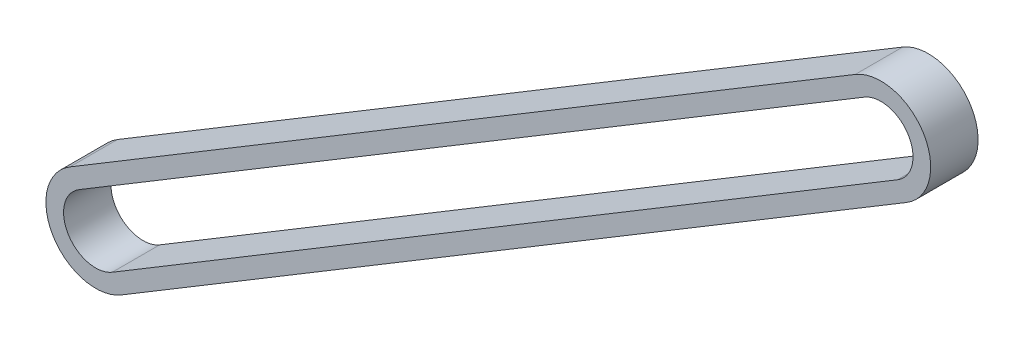
ISO-10303-21;
HEADER;
FILE_DESCRIPTION(('STEP AP214'),'2;1');
FILE_NAME('part.step','',(''),(''),'','','');
FILE_SCHEMA(('AUTOMOTIVE_DESIGN { 1 0 10303 214 1 1 1 1 }'));
ENDSEC;
DATA;
#1=APPLICATION_CONTEXT('core data for automotive mechanical design processes');
#2=APPLICATION_PROTOCOL_DEFINITION('international standard','automotive_design',2000,#1);
#3=PRODUCT_CONTEXT('',#1,'mechanical');
#4=PRODUCT('Part','Part','',(#3));
#5=PRODUCT_RELATED_PRODUCT_CATEGORY('part','',(#4));
#6=PRODUCT_DEFINITION_FORMATION('','',#4);
#7=PRODUCT_DEFINITION_CONTEXT('part definition',#1,'design');
#8=PRODUCT_DEFINITION('design','',#6,#7);
#9=PRODUCT_DEFINITION_SHAPE('','',#8);
#10=(LENGTH_UNIT() NAMED_UNIT(*) SI_UNIT(.MILLI.,.METRE.));
#11=(NAMED_UNIT(*) PLANE_ANGLE_UNIT() SI_UNIT($,.RADIAN.));
#12=(NAMED_UNIT(*) SI_UNIT($,.STERADIAN.) SOLID_ANGLE_UNIT());
#13=UNCERTAINTY_MEASURE_WITH_UNIT(LENGTH_MEASURE(1.E-05),#10,'distance_accuracy_value','');
#14=(GEOMETRIC_REPRESENTATION_CONTEXT(3) GLOBAL_UNCERTAINTY_ASSIGNED_CONTEXT((#13)) GLOBAL_UNIT_ASSIGNED_CONTEXT((#10,
#11,#12)) REPRESENTATION_CONTEXT('',''));
#15=CARTESIAN_POINT('',(0.,0.,0.));
#16=DIRECTION('',(0.,0.,1.));
#17=DIRECTION('',(1.,0.,0.));
#18=AXIS2_PLACEMENT_3D('',#15,#16,#17);
#19=CARTESIAN_POINT('',(-144.082900648749,202.518987605499,15.));
#20=DIRECTION('',(0.,0.,-1.));
#21=DIRECTION('',(-1.,0.,0.));
#22=AXIS2_PLACEMENT_3D('',#19,#20,#21);
#23=CYLINDRICAL_SURFACE('',#22,15.748);
#24=CARTESIAN_POINT('',(-144.082900648749,202.518987605499,0.));
#25=DIRECTION('',(0.,0.,1.));
#26=DIRECTION('',(1.,0.,0.));
#27=AXIS2_PLACEMENT_3D('',#24,#25,#26);
#28=CIRCLE('',#27,15.748);
#29=CARTESIAN_POINT('',(-152.204842254837,216.010969244506,0.));
#30=VERTEX_POINT('',#29);
#31=CARTESIAN_POINT('',(-135.960959042661,189.027005966492,0.));
#32=VERTEX_POINT('',#31);
#33=EDGE_CURVE('E157',#30,#32,#28,.T.);
#34=ORIENTED_EDGE('',*,*,#33,.T.);
#35=DIRECTION('',(0.,0.,-1.));
#36=VECTOR('',#35,1.);
#37=CARTESIAN_POINT('',(-135.960959042661,189.027005966492,15.));
#38=LINE('',#37,#36);
#39=CARTESIAN_POINT('',(-135.960959042661,189.027005966492,15.));
#40=VERTEX_POINT('',#39);
#41=EDGE_CURVE('E11',#40,#32,#38,.T.);
#42=ORIENTED_EDGE('',*,*,#41,.F.);
#43=CARTESIAN_POINT('',(-144.082900648749,202.518987605499,15.));
#44=DIRECTION('',(0.,0.,1.));
#45=DIRECTION('',(1.,0.,0.));
#46=AXIS2_PLACEMENT_3D('',#43,#44,#45);
#47=CIRCLE('',#46,15.748);
#48=CARTESIAN_POINT('',(-152.204842254837,216.010969244506,15.));
#49=VERTEX_POINT('',#48);
#50=EDGE_CURVE('E163',#49,#40,#47,.T.);
#51=ORIENTED_EDGE('',*,*,#50,.F.);
#52=DIRECTION('',(0.,0.,-1.));
#53=VECTOR('',#52,1.);
#54=CARTESIAN_POINT('',(-152.204842254837,216.010969244506,15.));
#55=LINE('',#54,#53);
#56=EDGE_CURVE('E177',#49,#30,#55,.T.);
#57=ORIENTED_EDGE('',*,*,#56,.T.);
#58=EDGE_LOOP('',(#34,#42,#51,#57));
#59=FACE_BOUND('',#58,.T.);
#60=ADVANCED_FACE('F49',(#59),#23,.T.);
#61=CARTESIAN_POINT('',(-135.960959042661,189.027005966492,15.));
#62=DIRECTION('',(-0.515744323475226,0.856742547562032,0.));
#63=DIRECTION('',(-0.856742547562032,-0.515744323475227,0.));
#64=AXIS2_PLACEMENT_3D('',#61,#62,#63);
#65=PLANE('',#64);
#66=DIRECTION('',(0.856742547562032,0.515744323475226,0.));
#67=VECTOR('',#66,1.);
#68=CARTESIAN_POINT('',(-135.960959042661,189.027005966492,0.));
#69=LINE('',#68,#67);
#70=CARTESIAN_POINT('',(112.548778231137,338.62560672701,0.));
#71=VERTEX_POINT('',#70);
#72=EDGE_CURVE('E181',#32,#71,#69,.T.);
#73=ORIENTED_EDGE('',*,*,#72,.T.);
#74=DIRECTION('',(0.,0.,-1.));
#75=VECTOR('',#74,1.);
#76=CARTESIAN_POINT('',(112.548778231137,338.62560672701,15.));
#77=LINE('',#76,#75);
#78=CARTESIAN_POINT('',(112.548778231137,338.62560672701,15.));
#79=VERTEX_POINT('',#78);
#80=EDGE_CURVE('E57',#79,#71,#77,.T.);
#81=ORIENTED_EDGE('',*,*,#80,.F.);
#82=DIRECTION('',(0.856742547562032,0.515744323475226,0.));
#83=VECTOR('',#82,1.);
#84=CARTESIAN_POINT('',(-135.960959042661,189.027005966492,15.));
#85=LINE('',#84,#83);
#86=EDGE_CURVE('E167',#40,#79,#85,.T.);
#87=ORIENTED_EDGE('',*,*,#86,.F.);
#88=ORIENTED_EDGE('',*,*,#41,.T.);
#89=EDGE_LOOP('',(#73,#81,#87,#88));
#90=FACE_BOUND('',#89,.T.);
#91=ADVANCED_FACE('F215',(#90),#65,.F.);
#92=CARTESIAN_POINT('',(104.426836625051,352.117588366015,15.));
#93=DIRECTION('',(0.,0.,-1.));
#94=DIRECTION('',(-1.,0.,0.));
#95=AXIS2_PLACEMENT_3D('',#92,#93,#94);
#96=CYLINDRICAL_SURFACE('',#95,15.7479999999974);
#97=CARTESIAN_POINT('',(104.426836625051,352.117588366015,0.));
#98=DIRECTION('',(0.,0.,1.));
#99=DIRECTION('',(1.,0.,0.));
#100=AXIS2_PLACEMENT_3D('',#97,#98,#99);
#101=CIRCLE('',#100,15.7479999999974);
#102=CARTESIAN_POINT('',(96.3048950189646,365.60957000502,0.));
#103=VERTEX_POINT('',#102);
#104=EDGE_CURVE('E184',#71,#103,#101,.T.);
#105=ORIENTED_EDGE('',*,*,#104,.T.);
#106=DIRECTION('',(0.,0.,-1.));
#107=VECTOR('',#106,1.);
#108=CARTESIAN_POINT('',(96.3048950189646,365.60957000502,15.));
#109=LINE('',#108,#107);
#110=CARTESIAN_POINT('',(96.3048950189646,365.60957000502,15.));
#111=VERTEX_POINT('',#110);
#112=EDGE_CURVE('E192',#111,#103,#109,.T.);
#113=ORIENTED_EDGE('',*,*,#112,.F.);
#114=CARTESIAN_POINT('',(104.426836625051,352.117588366015,15.));
#115=DIRECTION('',(0.,0.,1.));
#116=DIRECTION('',(1.,0.,0.));
#117=AXIS2_PLACEMENT_3D('',#114,#115,#116);
#118=CIRCLE('',#117,15.7479999999974);
#119=EDGE_CURVE('E171',#79,#111,#118,.T.);
#120=ORIENTED_EDGE('',*,*,#119,.F.);
#121=ORIENTED_EDGE('',*,*,#80,.T.);
#122=EDGE_LOOP('',(#105,#113,#120,#121));
#123=FACE_BOUND('',#122,.T.);
#124=ADVANCED_FACE('F201',(#123),#96,.T.);
#125=CARTESIAN_POINT('',(-152.204842254837,216.010969244506,15.));
#126=DIRECTION('',(0.515744323475211,-0.856742547562041,0.));
#127=DIRECTION('',(0.856742547562042,0.515744323475211,0.));
#128=AXIS2_PLACEMENT_3D('',#125,#126,#127);
#129=PLANE('',#128);
#130=DIRECTION('',(-0.856742547562041,-0.515744323475211,0.));
#131=VECTOR('',#130,1.);
#132=CARTESIAN_POINT('',(-152.204842254837,216.010969244506,0.));
#133=LINE('',#132,#131);
#134=EDGE_CURVE('E168',#103,#30,#133,.T.);
#135=ORIENTED_EDGE('',*,*,#134,.T.);
#136=ORIENTED_EDGE('',*,*,#56,.F.);
#137=DIRECTION('',(-0.856742547562041,-0.515744323475211,0.));
#138=VECTOR('',#137,1.);
#139=CARTESIAN_POINT('',(-152.204842254837,216.010969244506,15.));
#140=LINE('',#139,#138);
#141=EDGE_CURVE('E174',#111,#49,#140,.T.);
#142=ORIENTED_EDGE('',*,*,#141,.F.);
#143=ORIENTED_EDGE('',*,*,#112,.T.);
#144=EDGE_LOOP('',(#135,#136,#142,#143));
#145=FACE_BOUND('',#144,.T.);
#146=ADVANCED_FACE('F208',(#145),#129,.F.);
#147=CARTESIAN_POINT('',(-144.082900648749,202.518987605499,15.));
#148=DIRECTION('',(0.,0.,1.));
#149=DIRECTION('',(1.,0.,0.));
#150=AXIS2_PLACEMENT_3D('',#147,#148,#149);
#151=PLANE('',#150);
#152=CARTESIAN_POINT('',(-144.082900648749,202.518987605499,15.));
#153=DIRECTION('',(0.,0.,1.));
#154=DIRECTION('',(1.,0.,0.));
#155=AXIS2_PLACEMENT_3D('',#152,#153,#154);
#156=CIRCLE('',#155,10.16);
#157=CARTESIAN_POINT('',(-149.322862975257,211.22349188873,15.));
#158=VERTEX_POINT('',#157);
#159=CARTESIAN_POINT('',(-138.842938322241,193.814483322269,15.));
#160=VERTEX_POINT('',#159);
#161=EDGE_CURVE('E64',#158,#160,#156,.T.);
#162=ORIENTED_EDGE('',*,*,#161,.F.);
#163=DIRECTION('',(0.856742547562037,0.515744323475219,0.));
#164=VECTOR('',#163,1.);
#165=CARTESIAN_POINT('',(-133.049952335699,221.019505069882,15.));
#166=LINE('',#165,#164);
#167=CARTESIAN_POINT('',(99.1868742985426,360.822092649245,15.));
#168=VERTEX_POINT('',#167);
#169=EDGE_CURVE('E135',#158,#168,#166,.T.);
#170=ORIENTED_EDGE('',*,*,#169,.T.);
#171=CARTESIAN_POINT('',(104.426836625051,352.117588366015,15.));
#172=DIRECTION('',(0.,0.,1.));
#173=DIRECTION('',(1.,0.,0.));
#174=AXIS2_PLACEMENT_3D('',#171,#172,#173);
#175=CIRCLE('',#174,10.16);
#176=CARTESIAN_POINT('',(109.666798951559,343.413084082785,15.));
#177=VERTEX_POINT('',#176);
#178=EDGE_CURVE('E139',#177,#168,#175,.T.);
#179=ORIENTED_EDGE('',*,*,#178,.F.);
#180=DIRECTION('',(0.856742547562037,0.515744323475219,0.));
#181=VECTOR('',#180,1.);
#182=CARTESIAN_POINT('',(-122.570027682682,203.610496503422,15.));
#183=LINE('',#182,#181);
#184=EDGE_CURVE('E148',#160,#177,#183,.T.);
#185=ORIENTED_EDGE('',*,*,#184,.F.);
#186=EDGE_LOOP('',(#162,#170,#179,#185));
#187=FACE_BOUND('',#186,.T.);
#188=ORIENTED_EDGE('',*,*,#50,.T.);
#189=ORIENTED_EDGE('',*,*,#86,.T.);
#190=ORIENTED_EDGE('',*,*,#119,.T.);
#191=ORIENTED_EDGE('',*,*,#141,.T.);
#192=EDGE_LOOP('',(#188,#189,#190,#191));
#193=FACE_BOUND('',#192,.T.);
#194=ADVANCED_FACE('F214',(#187,#193),#151,.T.);
#195=CARTESIAN_POINT('',(-144.082900648749,202.518987605499,0.));
#196=DIRECTION('',(0.,0.,1.));
#197=DIRECTION('',(1.,0.,0.));
#198=AXIS2_PLACEMENT_3D('',#195,#196,#197);
#199=PLANE('',#198);
#200=DIRECTION('',(0.856742547562037,0.515744323475219,0.));
#201=VECTOR('',#200,1.);
#202=CARTESIAN_POINT('',(-133.049952335699,221.019505069882,0.));
#203=LINE('',#202,#201);
#204=CARTESIAN_POINT('',(-149.322862975257,211.22349188873,0.));
#205=VERTEX_POINT('',#204);
#206=CARTESIAN_POINT('',(99.1868742985426,360.822092649245,0.));
#207=VERTEX_POINT('',#206);
#208=EDGE_CURVE('E124',#205,#207,#203,.T.);
#209=ORIENTED_EDGE('',*,*,#208,.F.);
#210=CARTESIAN_POINT('',(-144.082900648749,202.518987605499,0.));
#211=DIRECTION('',(0.,0.,1.));
#212=DIRECTION('',(1.,0.,0.));
#213=AXIS2_PLACEMENT_3D('',#210,#211,#212);
#214=CIRCLE('',#213,10.16);
#215=CARTESIAN_POINT('',(-138.842938322241,193.814483322269,0.));
#216=VERTEX_POINT('',#215);
#217=EDGE_CURVE('E117',#205,#216,#214,.T.);
#218=ORIENTED_EDGE('',*,*,#217,.T.);
#219=DIRECTION('',(0.856742547562037,0.515744323475219,0.));
#220=VECTOR('',#219,1.);
#221=CARTESIAN_POINT('',(-122.570027682682,203.610496503422,0.));
#222=LINE('',#221,#220);
#223=CARTESIAN_POINT('',(109.666798951559,343.413084082785,0.));
#224=VERTEX_POINT('',#223);
#225=EDGE_CURVE('E127',#216,#224,#222,.T.);
#226=ORIENTED_EDGE('',*,*,#225,.T.);
#227=CARTESIAN_POINT('',(104.426836625051,352.117588366015,0.));
#228=DIRECTION('',(0.,0.,1.));
#229=DIRECTION('',(1.,0.,0.));
#230=AXIS2_PLACEMENT_3D('',#227,#228,#229);
#231=CIRCLE('',#230,10.16);
#232=EDGE_CURVE('E72',#224,#207,#231,.T.);
#233=ORIENTED_EDGE('',*,*,#232,.T.);
#234=EDGE_LOOP('',(#209,#218,#226,#233));
#235=FACE_BOUND('',#234,.T.);
#236=ORIENTED_EDGE('',*,*,#33,.F.);
#237=ORIENTED_EDGE('',*,*,#134,.F.);
#238=ORIENTED_EDGE('',*,*,#104,.F.);
#239=ORIENTED_EDGE('',*,*,#72,.F.);
#240=EDGE_LOOP('',(#236,#237,#238,#239));
#241=FACE_BOUND('',#240,.T.);
#242=ADVANCED_FACE('F132',(#235,#241),#199,.F.);
#243=CARTESIAN_POINT('',(-144.082900648749,202.518987605499,0.));
#244=DIRECTION('',(0.,0.,1.));
#245=DIRECTION('',(1.,0.,0.));
#246=AXIS2_PLACEMENT_3D('',#243,#244,#245);
#247=CYLINDRICAL_SURFACE('',#246,10.16);
#248=ORIENTED_EDGE('',*,*,#161,.T.);
#249=DIRECTION('',(0.,0.,1.));
#250=VECTOR('',#249,1.);
#251=CARTESIAN_POINT('',(-138.842938322241,193.814483322269,0.));
#252=LINE('',#251,#250);
#253=EDGE_CURVE('E113',#216,#160,#252,.T.);
#254=ORIENTED_EDGE('',*,*,#253,.F.);
#255=ORIENTED_EDGE('',*,*,#217,.F.);
#256=DIRECTION('',(0.,0.,1.));
#257=VECTOR('',#256,1.);
#258=CARTESIAN_POINT('',(-149.322862975257,211.22349188873,0.));
#259=LINE('',#258,#257);
#260=EDGE_CURVE('E154',#205,#158,#259,.T.);
#261=ORIENTED_EDGE('',*,*,#260,.T.);
#262=EDGE_LOOP('',(#248,#254,#255,#261));
#263=FACE_BOUND('',#262,.T.);
#264=ADVANCED_FACE('F115',(#263),#247,.F.);
#265=CARTESIAN_POINT('',(-133.049952335699,221.019505069882,0.));
#266=DIRECTION('',(0.515744323475219,-0.856742547562037,0.));
#267=DIRECTION('',(0.856742547562037,0.515744323475219,0.));
#268=AXIS2_PLACEMENT_3D('',#265,#266,#267);
#269=PLANE('',#268);
#270=ORIENTED_EDGE('',*,*,#169,.F.);
#271=ORIENTED_EDGE('',*,*,#260,.F.);
#272=ORIENTED_EDGE('',*,*,#208,.T.);
#273=DIRECTION('',(0.,0.,1.));
#274=VECTOR('',#273,1.);
#275=CARTESIAN_POINT('',(99.1868742985426,360.822092649245,0.));
#276=LINE('',#275,#274);
#277=EDGE_CURVE('E158',#207,#168,#276,.T.);
#278=ORIENTED_EDGE('',*,*,#277,.T.);
#279=EDGE_LOOP('',(#270,#271,#272,#278));
#280=FACE_BOUND('',#279,.T.);
#281=ADVANCED_FACE('F232',(#280),#269,.T.);
#282=CARTESIAN_POINT('',(104.426836625051,352.117588366015,0.));
#283=DIRECTION('',(0.,0.,1.));
#284=DIRECTION('',(1.,0.,0.));
#285=AXIS2_PLACEMENT_3D('',#282,#283,#284);
#286=CYLINDRICAL_SURFACE('',#285,10.16);
#287=ORIENTED_EDGE('',*,*,#178,.T.);
#288=ORIENTED_EDGE('',*,*,#277,.F.);
#289=ORIENTED_EDGE('',*,*,#232,.F.);
#290=DIRECTION('',(0.,0.,1.));
#291=VECTOR('',#290,1.);
#292=CARTESIAN_POINT('',(109.666798951559,343.413084082785,0.));
#293=LINE('',#292,#291);
#294=EDGE_CURVE('E123',#224,#177,#293,.T.);
#295=ORIENTED_EDGE('',*,*,#294,.T.);
#296=EDGE_LOOP('',(#287,#288,#289,#295));
#297=FACE_BOUND('',#296,.T.);
#298=ADVANCED_FACE('F235',(#297),#286,.F.);
#299=CARTESIAN_POINT('',(-122.570027682682,203.610496503422,0.));
#300=DIRECTION('',(0.515744323475219,-0.856742547562037,0.));
#301=DIRECTION('',(0.856742547562037,0.515744323475219,0.));
#302=AXIS2_PLACEMENT_3D('',#299,#300,#301);
#303=PLANE('',#302);
#304=ORIENTED_EDGE('',*,*,#184,.T.);
#305=ORIENTED_EDGE('',*,*,#294,.F.);
#306=ORIENTED_EDGE('',*,*,#225,.F.);
#307=ORIENTED_EDGE('',*,*,#253,.T.);
#308=EDGE_LOOP('',(#304,#305,#306,#307));
#309=FACE_BOUND('',#308,.T.);
#310=ADVANCED_FACE('F128',(#309),#303,.F.);
#311=CLOSED_SHELL('',(#60,#91,#124,#146,#194,#242,#264,#281,#298,#310));
#312=MANIFOLD_SOLID_BREP('B2',#311);
#313=ADVANCED_BREP_SHAPE_REPRESENTATION('',(#18,#312),#14);
#314=SHAPE_DEFINITION_REPRESENTATION(#9,#313);
ENDSEC;
END-ISO-10303-21;
